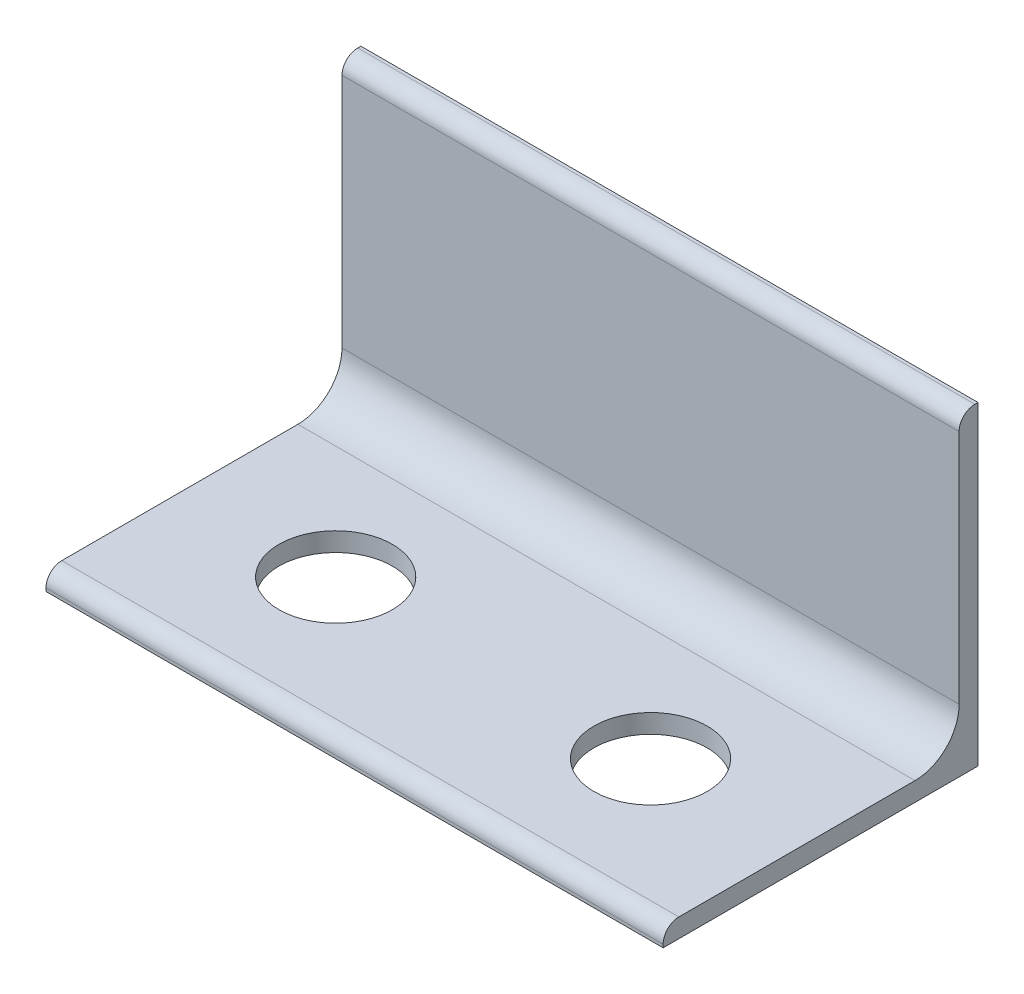
ISO-10303-21;
HEADER;
FILE_DESCRIPTION(('STEP AP214'),'2;1');
FILE_NAME('part.step','',(''),(''),'','','');
FILE_SCHEMA(('AUTOMOTIVE_DESIGN { 1 0 10303 214 1 1 1 1 }'));
ENDSEC;
DATA;
#1=APPLICATION_CONTEXT('core data for automotive mechanical design processes');
#2=APPLICATION_PROTOCOL_DEFINITION('international standard','automotive_design',2000,#1);
#3=PRODUCT_CONTEXT('',#1,'mechanical');
#4=PRODUCT('Part','Part','',(#3));
#5=PRODUCT_RELATED_PRODUCT_CATEGORY('part','',(#4));
#6=PRODUCT_DEFINITION_FORMATION('','',#4);
#7=PRODUCT_DEFINITION_CONTEXT('part definition',#1,'design');
#8=PRODUCT_DEFINITION('design','',#6,#7);
#9=PRODUCT_DEFINITION_SHAPE('','',#8);
#10=(LENGTH_UNIT() NAMED_UNIT(*) SI_UNIT(.MILLI.,.METRE.));
#11=(NAMED_UNIT(*) PLANE_ANGLE_UNIT() SI_UNIT($,.RADIAN.));
#12=(NAMED_UNIT(*) SI_UNIT($,.STERADIAN.) SOLID_ANGLE_UNIT());
#13=UNCERTAINTY_MEASURE_WITH_UNIT(LENGTH_MEASURE(1.E-05),#10,'distance_accuracy_value','');
#14=(GEOMETRIC_REPRESENTATION_CONTEXT(3) GLOBAL_UNCERTAINTY_ASSIGNED_CONTEXT((#13)) GLOBAL_UNIT_ASSIGNED_CONTEXT((#10,
#11,#12)) REPRESENTATION_CONTEXT('',''));
#15=CARTESIAN_POINT('',(0.,0.,0.));
#16=DIRECTION('',(0.,0.,1.));
#17=DIRECTION('',(1.,0.,0.));
#18=AXIS2_PLACEMENT_3D('',#15,#16,#17);
#19=CARTESIAN_POINT('',(98.,0.,0.));
#20=DIRECTION('',(0.,0.,1.));
#21=DIRECTION('',(1.,0.,0.));
#22=AXIS2_PLACEMENT_3D('',#19,#20,#21);
#23=PLANE('',#22);
#24=DIRECTION('',(0.,1.,0.));
#25=VECTOR('',#24,1.);
#26=CARTESIAN_POINT('',(0.,0.,0.));
#27=LINE('',#26,#25);
#28=CARTESIAN_POINT('',(0.,0.,0.));
#29=VERTEX_POINT('',#28);
#30=CARTESIAN_POINT('',(0.,50.,0.));
#31=VERTEX_POINT('',#30);
#32=EDGE_CURVE('E175',#29,#31,#27,.T.);
#33=ORIENTED_EDGE('',*,*,#32,.T.);
#34=DIRECTION('',(-1.,0.,0.));
#35=VECTOR('',#34,1.);
#36=CARTESIAN_POINT('',(98.,50.,0.));
#37=LINE('',#36,#35);
#38=CARTESIAN_POINT('',(98.,50.,0.));
#39=VERTEX_POINT('',#38);
#40=EDGE_CURVE('E13',#39,#31,#37,.T.);
#41=ORIENTED_EDGE('',*,*,#40,.F.);
#42=DIRECTION('',(0.,1.,0.));
#43=VECTOR('',#42,1.);
#44=CARTESIAN_POINT('',(98.,0.,0.));
#45=LINE('',#44,#43);
#46=CARTESIAN_POINT('',(98.,0.,0.));
#47=VERTEX_POINT('',#46);
#48=EDGE_CURVE('E192',#47,#39,#45,.T.);
#49=ORIENTED_EDGE('',*,*,#48,.F.);
#50=DIRECTION('',(-1.,0.,0.));
#51=VECTOR('',#50,1.);
#52=CARTESIAN_POINT('',(98.,0.,0.));
#53=LINE('',#52,#51);
#54=EDGE_CURVE('E171',#47,#29,#53,.T.);
#55=ORIENTED_EDGE('',*,*,#54,.T.);
#56=EDGE_LOOP('',(#33,#41,#49,#55));
#57=FACE_BOUND('',#56,.T.);
#58=ADVANCED_FACE('F73',(#57),#23,.F.);
#59=CARTESIAN_POINT('',(98.,50.,0.));
#60=DIRECTION('',(0.,-1.,0.));
#61=DIRECTION('',(0.,0.,-1.));
#62=AXIS2_PLACEMENT_3D('',#59,#60,#61);
#63=PLANE('',#62);
#64=DIRECTION('',(0.,0.,1.));
#65=VECTOR('',#64,1.);
#66=CARTESIAN_POINT('',(0.,50.,0.));
#67=LINE('',#66,#65);
#68=CARTESIAN_POINT('',(0.,50.,0.5));
#69=VERTEX_POINT('',#68);
#70=EDGE_CURVE('E178',#31,#69,#67,.T.);
#71=ORIENTED_EDGE('',*,*,#70,.T.);
#72=DIRECTION('',(-1.,0.,0.));
#73=VECTOR('',#72,1.);
#74=CARTESIAN_POINT('',(98.,50.,0.5));
#75=LINE('',#74,#73);
#76=CARTESIAN_POINT('',(98.,50.,0.5));
#77=VERTEX_POINT('',#76);
#78=EDGE_CURVE('E81',#77,#69,#75,.T.);
#79=ORIENTED_EDGE('',*,*,#78,.F.);
#80=DIRECTION('',(0.,0.,1.));
#81=VECTOR('',#80,1.);
#82=CARTESIAN_POINT('',(98.,50.,0.));
#83=LINE('',#82,#81);
#84=EDGE_CURVE('E135',#39,#77,#83,.T.);
#85=ORIENTED_EDGE('',*,*,#84,.F.);
#86=ORIENTED_EDGE('',*,*,#40,.T.);
#87=EDGE_LOOP('',(#71,#79,#85,#86));
#88=FACE_BOUND('',#87,.T.);
#89=ADVANCED_FACE('F274',(#88),#63,.F.);
#90=CARTESIAN_POINT('',(98.,47.5,0.5));
#91=DIRECTION('',(-1.,0.,0.));
#92=DIRECTION('',(0.,0.,1.));
#93=AXIS2_PLACEMENT_3D('',#90,#91,#92);
#94=CYLINDRICAL_SURFACE('',#93,2.5);
#95=CARTESIAN_POINT('',(0.,47.5,0.5));
#96=DIRECTION('',(1.,0.,0.));
#97=DIRECTION('',(0.,0.,-1.));
#98=AXIS2_PLACEMENT_3D('',#95,#96,#97);
#99=CIRCLE('',#98,2.5);
#100=CARTESIAN_POINT('',(0.,47.5,3.));
#101=VERTEX_POINT('',#100);
#102=EDGE_CURVE('E181',#69,#101,#99,.T.);
#103=ORIENTED_EDGE('',*,*,#102,.T.);
#104=DIRECTION('',(-1.,0.,0.));
#105=VECTOR('',#104,1.);
#106=CARTESIAN_POINT('',(98.,47.5,3.));
#107=LINE('',#106,#105);
#108=CARTESIAN_POINT('',(98.,47.5,3.));
#109=VERTEX_POINT('',#108);
#110=EDGE_CURVE('E202',#109,#101,#107,.T.);
#111=ORIENTED_EDGE('',*,*,#110,.F.);
#112=CARTESIAN_POINT('',(98.,47.5,0.5));
#113=DIRECTION('',(1.,0.,0.));
#114=DIRECTION('',(0.,0.,-1.));
#115=AXIS2_PLACEMENT_3D('',#112,#113,#114);
#116=CIRCLE('',#115,2.5);
#117=EDGE_CURVE('E210',#77,#109,#116,.T.);
#118=ORIENTED_EDGE('',*,*,#117,.F.);
#119=ORIENTED_EDGE('',*,*,#78,.T.);
#120=EDGE_LOOP('',(#103,#111,#118,#119));
#121=FACE_BOUND('',#120,.T.);
#122=ADVANCED_FACE('F208',(#121),#94,.T.);
#123=CARTESIAN_POINT('',(98.,47.5,3.));
#124=DIRECTION('',(0.,0.,-1.));
#125=DIRECTION('',(0.,1.,0.));
#126=AXIS2_PLACEMENT_3D('',#123,#124,#125);
#127=PLANE('',#126);
#128=DIRECTION('',(0.,-1.,0.));
#129=VECTOR('',#128,1.);
#130=CARTESIAN_POINT('',(0.,47.5,3.));
#131=LINE('',#130,#129);
#132=CARTESIAN_POINT('',(0.,9.99999999999999,3.));
#133=VERTEX_POINT('',#132);
#134=EDGE_CURVE('E183',#101,#133,#131,.T.);
#135=ORIENTED_EDGE('',*,*,#134,.T.);
#136=DIRECTION('',(-1.,0.,0.));
#137=VECTOR('',#136,1.);
#138=CARTESIAN_POINT('',(98.,9.99999999999999,3.));
#139=LINE('',#138,#137);
#140=CARTESIAN_POINT('',(98.,9.99999999999999,3.));
#141=VERTEX_POINT('',#140);
#142=EDGE_CURVE('E199',#141,#133,#139,.T.);
#143=ORIENTED_EDGE('',*,*,#142,.F.);
#144=DIRECTION('',(0.,-1.,0.));
#145=VECTOR('',#144,1.);
#146=CARTESIAN_POINT('',(98.,47.5,3.));
#147=LINE('',#146,#145);
#148=EDGE_CURVE('E226',#109,#141,#147,.T.);
#149=ORIENTED_EDGE('',*,*,#148,.F.);
#150=ORIENTED_EDGE('',*,*,#110,.T.);
#151=EDGE_LOOP('',(#135,#143,#149,#150));
#152=FACE_BOUND('',#151,.T.);
#153=ADVANCED_FACE('F219',(#152),#127,.F.);
#154=CARTESIAN_POINT('',(98.,9.99999999999999,10.));
#155=DIRECTION('',(-1.,0.,0.));
#156=DIRECTION('',(0.,0.,1.));
#157=AXIS2_PLACEMENT_3D('',#154,#155,#156);
#158=CYLINDRICAL_SURFACE('',#157,7.);
#159=CARTESIAN_POINT('',(0.,9.99999999999999,10.));
#160=DIRECTION('',(-1.,0.,0.));
#161=DIRECTION('',(0.,0.,1.));
#162=AXIS2_PLACEMENT_3D('',#159,#160,#161);
#163=CIRCLE('',#162,7.);
#164=CARTESIAN_POINT('',(0.,2.99999999999999,10.));
#165=VERTEX_POINT('',#164);
#166=EDGE_CURVE('E185',#133,#165,#163,.T.);
#167=ORIENTED_EDGE('',*,*,#166,.T.);
#168=DIRECTION('',(-1.,0.,0.));
#169=VECTOR('',#168,1.);
#170=CARTESIAN_POINT('',(98.,2.99999999999999,10.));
#171=LINE('',#170,#169);
#172=CARTESIAN_POINT('',(98.,2.99999999999999,10.));
#173=VERTEX_POINT('',#172);
#174=EDGE_CURVE('E196',#173,#165,#171,.T.);
#175=ORIENTED_EDGE('',*,*,#174,.F.);
#176=CARTESIAN_POINT('',(98.,9.99999999999999,10.));
#177=DIRECTION('',(-1.,0.,0.));
#178=DIRECTION('',(0.,0.,1.));
#179=AXIS2_PLACEMENT_3D('',#176,#177,#178);
#180=CIRCLE('',#179,7.);
#181=EDGE_CURVE('E225',#141,#173,#180,.T.);
#182=ORIENTED_EDGE('',*,*,#181,.F.);
#183=ORIENTED_EDGE('',*,*,#142,.T.);
#184=EDGE_LOOP('',(#167,#175,#182,#183));
#185=FACE_BOUND('',#184,.T.);
#186=ADVANCED_FACE('F223',(#185),#158,.F.);
#187=CARTESIAN_POINT('',(98.,2.99999999999999,10.));
#188=DIRECTION('',(0.,-1.,0.));
#189=DIRECTION('',(0.,0.,-1.));
#190=AXIS2_PLACEMENT_3D('',#187,#188,#189);
#191=PLANE('',#190);
#192=CARTESIAN_POINT('',(74.,2.99999999999999,28.));
#193=DIRECTION('',(0.,1.,0.));
#194=DIRECTION('',(0.,0.,1.));
#195=AXIS2_PLACEMENT_3D('',#192,#193,#194);
#196=CIRCLE('',#195,8.99999999999999);
#197=CARTESIAN_POINT('',(74.,2.99999999999999,37.));
#198=VERTEX_POINT('',#197);
#199=EDGE_CURVE('E238',#198,#198,#196,.T.);
#200=ORIENTED_EDGE('',*,*,#199,.F.);
#201=EDGE_LOOP('',(#200));
#202=FACE_BOUND('',#201,.T.);
#203=CARTESIAN_POINT('',(24.,2.99999999999999,28.));
#204=DIRECTION('',(0.,1.,0.));
#205=DIRECTION('',(0.,0.,1.));
#206=AXIS2_PLACEMENT_3D('',#203,#204,#205);
#207=CIRCLE('',#206,8.99999999999999);
#208=CARTESIAN_POINT('',(24.,2.99999999999999,37.));
#209=VERTEX_POINT('',#208);
#210=EDGE_CURVE('E235',#209,#209,#207,.T.);
#211=ORIENTED_EDGE('',*,*,#210,.F.);
#212=EDGE_LOOP('',(#211));
#213=FACE_BOUND('',#212,.T.);
#214=DIRECTION('',(0.,0.,1.));
#215=VECTOR('',#214,1.);
#216=CARTESIAN_POINT('',(0.,2.99999999999999,10.));
#217=LINE('',#216,#215);
#218=CARTESIAN_POINT('',(0.,2.99999999999999,47.5));
#219=VERTEX_POINT('',#218);
#220=EDGE_CURVE('E187',#165,#219,#217,.T.);
#221=ORIENTED_EDGE('',*,*,#220,.T.);
#222=DIRECTION('',(-1.,0.,0.));
#223=VECTOR('',#222,1.);
#224=CARTESIAN_POINT('',(98.,2.99999999999999,47.5));
#225=LINE('',#224,#223);
#226=CARTESIAN_POINT('',(98.,2.99999999999999,47.5));
#227=VERTEX_POINT('',#226);
#228=EDGE_CURVE('E166',#227,#219,#225,.T.);
#229=ORIENTED_EDGE('',*,*,#228,.F.);
#230=DIRECTION('',(0.,0.,1.));
#231=VECTOR('',#230,1.);
#232=CARTESIAN_POINT('',(98.,2.99999999999999,10.));
#233=LINE('',#232,#231);
#234=EDGE_CURVE('E157',#173,#227,#233,.T.);
#235=ORIENTED_EDGE('',*,*,#234,.F.);
#236=ORIENTED_EDGE('',*,*,#174,.T.);
#237=EDGE_LOOP('',(#221,#229,#235,#236));
#238=FACE_BOUND('',#237,.T.);
#239=ADVANCED_FACE('F255',(#202,#213,#238),#191,.F.);
#240=CARTESIAN_POINT('',(98.,0.499999999999994,47.5));
#241=DIRECTION('',(-1.,0.,0.));
#242=DIRECTION('',(0.,0.,1.));
#243=AXIS2_PLACEMENT_3D('',#240,#241,#242);
#244=CYLINDRICAL_SURFACE('',#243,2.5);
#245=CARTESIAN_POINT('',(0.,0.499999999999994,47.5));
#246=DIRECTION('',(1.,0.,0.));
#247=DIRECTION('',(0.,0.,-1.));
#248=AXIS2_PLACEMENT_3D('',#245,#246,#247);
#249=CIRCLE('',#248,2.5);
#250=CARTESIAN_POINT('',(0.,0.499999999999994,50.));
#251=VERTEX_POINT('',#250);
#252=EDGE_CURVE('E165',#219,#251,#249,.T.);
#253=ORIENTED_EDGE('',*,*,#252,.T.);
#254=DIRECTION('',(-1.,0.,0.));
#255=VECTOR('',#254,1.);
#256=CARTESIAN_POINT('',(98.,0.499999999999994,50.));
#257=LINE('',#256,#255);
#258=CARTESIAN_POINT('',(98.,0.499999999999994,50.));
#259=VERTEX_POINT('',#258);
#260=EDGE_CURVE('E162',#259,#251,#257,.T.);
#261=ORIENTED_EDGE('',*,*,#260,.F.);
#262=CARTESIAN_POINT('',(98.,0.499999999999994,47.5));
#263=DIRECTION('',(1.,0.,0.));
#264=DIRECTION('',(0.,0.,-1.));
#265=AXIS2_PLACEMENT_3D('',#262,#263,#264);
#266=CIRCLE('',#265,2.5);
#267=EDGE_CURVE('E151',#227,#259,#266,.T.);
#268=ORIENTED_EDGE('',*,*,#267,.F.);
#269=ORIENTED_EDGE('',*,*,#228,.T.);
#270=EDGE_LOOP('',(#253,#261,#268,#269));
#271=FACE_BOUND('',#270,.T.);
#272=ADVANCED_FACE('F163',(#271),#244,.T.);
#273=CARTESIAN_POINT('',(98.,0.499999999999994,50.));
#274=DIRECTION('',(0.,0.,-1.));
#275=DIRECTION('',(-1.,0.,0.));
#276=AXIS2_PLACEMENT_3D('',#273,#274,#275);
#277=PLANE('',#276);
#278=DIRECTION('',(0.,-1.,0.));
#279=VECTOR('',#278,1.);
#280=CARTESIAN_POINT('',(0.,0.499999999999994,50.));
#281=LINE('',#280,#279);
#282=CARTESIAN_POINT('',(0.,0.,50.));
#283=VERTEX_POINT('',#282);
#284=EDGE_CURVE('E121',#251,#283,#281,.T.);
#285=ORIENTED_EDGE('',*,*,#284,.T.);
#286=DIRECTION('',(-1.,0.,0.));
#287=VECTOR('',#286,1.);
#288=CARTESIAN_POINT('',(98.,0.,50.));
#289=LINE('',#288,#287);
#290=CARTESIAN_POINT('',(98.,0.,50.));
#291=VERTEX_POINT('',#290);
#292=EDGE_CURVE('E167',#291,#283,#289,.T.);
#293=ORIENTED_EDGE('',*,*,#292,.F.);
#294=DIRECTION('',(0.,-1.,0.));
#295=VECTOR('',#294,1.);
#296=CARTESIAN_POINT('',(98.,0.499999999999994,50.));
#297=LINE('',#296,#295);
#298=EDGE_CURVE('E155',#259,#291,#297,.T.);
#299=ORIENTED_EDGE('',*,*,#298,.F.);
#300=ORIENTED_EDGE('',*,*,#260,.T.);
#301=EDGE_LOOP('',(#285,#293,#299,#300));
#302=FACE_BOUND('',#301,.T.);
#303=ADVANCED_FACE('F169',(#302),#277,.F.);
#304=CARTESIAN_POINT('',(98.,0.,50.));
#305=DIRECTION('',(0.,1.,0.));
#306=DIRECTION('',(0.,0.,1.));
#307=AXIS2_PLACEMENT_3D('',#304,#305,#306);
#308=PLANE('',#307);
#309=CARTESIAN_POINT('',(74.,0.,28.));
#310=DIRECTION('',(0.,1.,0.));
#311=DIRECTION('',(0.,0.,1.));
#312=AXIS2_PLACEMENT_3D('',#309,#310,#311);
#313=CIRCLE('',#312,9.);
#314=CARTESIAN_POINT('',(74.,0.,37.));
#315=VERTEX_POINT('',#314);
#316=EDGE_CURVE('E241',#315,#315,#313,.T.);
#317=ORIENTED_EDGE('',*,*,#316,.T.);
#318=EDGE_LOOP('',(#317));
#319=FACE_BOUND('',#318,.T.);
#320=CARTESIAN_POINT('',(24.,0.,28.));
#321=DIRECTION('',(0.,1.,0.));
#322=DIRECTION('',(0.,0.,1.));
#323=AXIS2_PLACEMENT_3D('',#320,#321,#322);
#324=CIRCLE('',#323,9.);
#325=CARTESIAN_POINT('',(24.,0.,37.));
#326=VERTEX_POINT('',#325);
#327=EDGE_CURVE('E179',#326,#326,#324,.T.);
#328=ORIENTED_EDGE('',*,*,#327,.T.);
#329=EDGE_LOOP('',(#328));
#330=FACE_BOUND('',#329,.T.);
#331=DIRECTION('',(0.,0.,-1.));
#332=VECTOR('',#331,1.);
#333=CARTESIAN_POINT('',(0.,0.,50.));
#334=LINE('',#333,#332);
#335=EDGE_CURVE('E127',#283,#29,#334,.T.);
#336=ORIENTED_EDGE('',*,*,#335,.T.);
#337=ORIENTED_EDGE('',*,*,#54,.F.);
#338=DIRECTION('',(0.,0.,-1.));
#339=VECTOR('',#338,1.);
#340=CARTESIAN_POINT('',(98.,0.,50.));
#341=LINE('',#340,#339);
#342=EDGE_CURVE('E89',#291,#47,#341,.T.);
#343=ORIENTED_EDGE('',*,*,#342,.F.);
#344=ORIENTED_EDGE('',*,*,#292,.T.);
#345=EDGE_LOOP('',(#336,#337,#343,#344));
#346=FACE_BOUND('',#345,.T.);
#347=ADVANCED_FACE('F245',(#319,#330,#346),#308,.F.);
#348=CARTESIAN_POINT('',(98.,47.5,0.5));
#349=DIRECTION('',(1.,0.,0.));
#350=DIRECTION('',(0.,0.,-1.));
#351=AXIS2_PLACEMENT_3D('',#348,#349,#350);
#352=PLANE('',#351);
#353=ORIENTED_EDGE('',*,*,#48,.T.);
#354=ORIENTED_EDGE('',*,*,#84,.T.);
#355=ORIENTED_EDGE('',*,*,#117,.T.);
#356=ORIENTED_EDGE('',*,*,#148,.T.);
#357=ORIENTED_EDGE('',*,*,#181,.T.);
#358=ORIENTED_EDGE('',*,*,#234,.T.);
#359=ORIENTED_EDGE('',*,*,#267,.T.);
#360=ORIENTED_EDGE('',*,*,#298,.T.);
#361=ORIENTED_EDGE('',*,*,#342,.T.);
#362=EDGE_LOOP('',(#353,#354,#355,#356,#357,#358,#359,#360,#361));
#363=FACE_BOUND('',#362,.T.);
#364=ADVANCED_FACE('F153',(#363),#352,.T.);
#365=CARTESIAN_POINT('',(0.,47.5,0.5));
#366=DIRECTION('',(1.,0.,0.));
#367=DIRECTION('',(0.,0.,-1.));
#368=AXIS2_PLACEMENT_3D('',#365,#366,#367);
#369=PLANE('',#368);
#370=ORIENTED_EDGE('',*,*,#32,.F.);
#371=ORIENTED_EDGE('',*,*,#335,.F.);
#372=ORIENTED_EDGE('',*,*,#284,.F.);
#373=ORIENTED_EDGE('',*,*,#252,.F.);
#374=ORIENTED_EDGE('',*,*,#220,.F.);
#375=ORIENTED_EDGE('',*,*,#166,.F.);
#376=ORIENTED_EDGE('',*,*,#134,.F.);
#377=ORIENTED_EDGE('',*,*,#102,.F.);
#378=ORIENTED_EDGE('',*,*,#70,.F.);
#379=EDGE_LOOP('',(#370,#371,#372,#373,#374,#375,#376,#377,#378));
#380=FACE_BOUND('',#379,.T.);
#381=ADVANCED_FACE('F214',(#380),#369,.F.);
#382=CARTESIAN_POINT('',(24.,2.99999999999999,28.));
#383=DIRECTION('',(0.,1.,0.));
#384=DIRECTION('',(0.,0.,1.));
#385=AXIS2_PLACEMENT_3D('',#382,#383,#384);
#386=CYLINDRICAL_SURFACE('',#385,9.);
#387=ORIENTED_EDGE('',*,*,#327,.F.);
#388=EDGE_LOOP('',(#387));
#389=FACE_BOUND('',#388,.T.);
#390=ORIENTED_EDGE('',*,*,#210,.T.);
#391=EDGE_LOOP('',(#390));
#392=FACE_BOUND('',#391,.T.);
#393=ADVANCED_FACE('F251',(#389,#392),#386,.F.);
#394=CARTESIAN_POINT('',(74.,2.99999999999999,28.));
#395=DIRECTION('',(0.,1.,0.));
#396=DIRECTION('',(0.,0.,1.));
#397=AXIS2_PLACEMENT_3D('',#394,#395,#396);
#398=CYLINDRICAL_SURFACE('',#397,9.);
#399=ORIENTED_EDGE('',*,*,#316,.F.);
#400=EDGE_LOOP('',(#399));
#401=FACE_BOUND('',#400,.T.);
#402=ORIENTED_EDGE('',*,*,#199,.T.);
#403=EDGE_LOOP('',(#402));
#404=FACE_BOUND('',#403,.T.);
#405=ADVANCED_FACE('F248',(#401,#404),#398,.F.);
#406=CLOSED_SHELL('',(#58,#89,#122,#153,#186,#239,#272,#303,#347,#364,#381,#393,#405));
#407=MANIFOLD_SOLID_BREP('B2',#406);
#408=ADVANCED_BREP_SHAPE_REPRESENTATION('',(#18,#407),#14);
#409=SHAPE_DEFINITION_REPRESENTATION(#9,#408);
ENDSEC;
END-ISO-10303-21;
